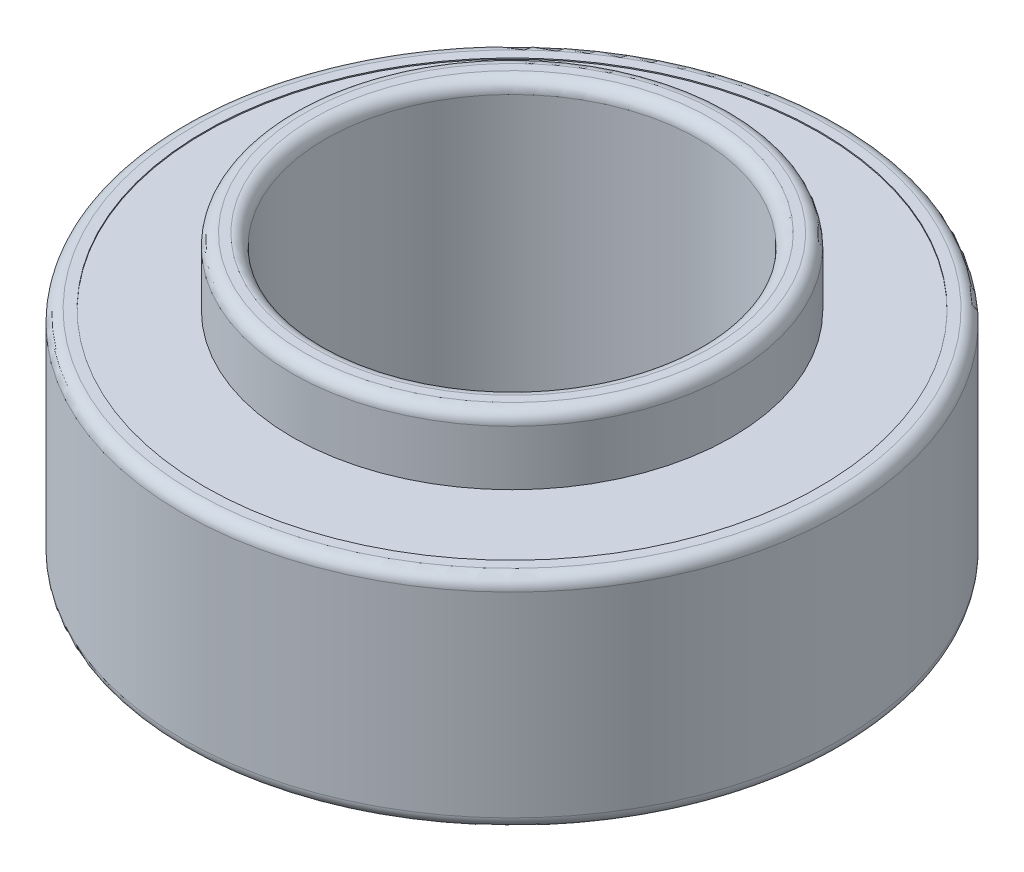
ISO-10303-21;
HEADER;
FILE_DESCRIPTION(('STEP AP214'),'2;1');
FILE_NAME('part.step','',(''),(''),'','','');
FILE_SCHEMA(('AUTOMOTIVE_DESIGN { 1 0 10303 214 1 1 1 1 }'));
ENDSEC;
DATA;
#1=APPLICATION_CONTEXT('core data for automotive mechanical design processes');
#2=APPLICATION_PROTOCOL_DEFINITION('international standard','automotive_design',2000,#1);
#3=PRODUCT_CONTEXT('',#1,'mechanical');
#4=PRODUCT('Part','Part','',(#3));
#5=PRODUCT_RELATED_PRODUCT_CATEGORY('part','',(#4));
#6=PRODUCT_DEFINITION_FORMATION('','',#4);
#7=PRODUCT_DEFINITION_CONTEXT('part definition',#1,'design');
#8=PRODUCT_DEFINITION('design','',#6,#7);
#9=PRODUCT_DEFINITION_SHAPE('','',#8);
#10=(LENGTH_UNIT() NAMED_UNIT(*) SI_UNIT(.MILLI.,.METRE.));
#11=(NAMED_UNIT(*) PLANE_ANGLE_UNIT() SI_UNIT($,.RADIAN.));
#12=(NAMED_UNIT(*) SI_UNIT($,.STERADIAN.) SOLID_ANGLE_UNIT());
#13=UNCERTAINTY_MEASURE_WITH_UNIT(LENGTH_MEASURE(1.E-05),#10,'distance_accuracy_value','');
#14=(GEOMETRIC_REPRESENTATION_CONTEXT(3) GLOBAL_UNCERTAINTY_ASSIGNED_CONTEXT((#13)) GLOBAL_UNIT_ASSIGNED_CONTEXT((#10,
#11,#12)) REPRESENTATION_CONTEXT('',''));
#15=CARTESIAN_POINT('',(0.,0.,0.));
#16=DIRECTION('',(0.,0.,1.));
#17=DIRECTION('',(1.,0.,0.));
#18=AXIS2_PLACEMENT_3D('',#15,#16,#17);
#19=CARTESIAN_POINT('',(0.,-5.,0.));
#20=DIRECTION('',(0.,1.,0.));
#21=DIRECTION('',(0.,0.,1.));
#22=AXIS2_PLACEMENT_3D('',#19,#20,#21);
#23=PLANE('',#22);
#24=CARTESIAN_POINT('',(0.,-5.,0.));
#25=DIRECTION('',(0.,1.,0.));
#26=DIRECTION('',(0.,0.,1.));
#27=AXIS2_PLACEMENT_3D('',#24,#25,#26);
#28=CIRCLE('',#27,9.05);
#29=CARTESIAN_POINT('',(0.,-5.,9.05));
#30=VERTEX_POINT('',#29);
#31=EDGE_CURVE('E77',#30,#30,#28,.T.);
#32=ORIENTED_EDGE('',*,*,#31,.T.);
#33=EDGE_LOOP('',(#32));
#34=FACE_BOUND('',#33,.T.);
#35=CARTESIAN_POINT('',(0.,-5.,0.));
#36=DIRECTION('',(0.,1.,0.));
#37=DIRECTION('',(0.,0.,1.));
#38=AXIS2_PLACEMENT_3D('',#35,#36,#37);
#39=CIRCLE('',#38,10.);
#40=CARTESIAN_POINT('',(0.,-5.,10.));
#41=VERTEX_POINT('',#40);
#42=EDGE_CURVE('E118',#41,#41,#39,.T.);
#43=ORIENTED_EDGE('',*,*,#42,.F.);
#44=EDGE_LOOP('',(#43));
#45=FACE_BOUND('',#44,.T.);
#46=ADVANCED_FACE('F49',(#34,#45),#23,.F.);
#47=CARTESIAN_POINT('',(0.,5.,0.));
#48=DIRECTION('',(0.,1.,0.));
#49=DIRECTION('',(0.,0.,1.));
#50=AXIS2_PLACEMENT_3D('',#47,#48,#49);
#51=PLANE('',#50);
#52=CARTESIAN_POINT('',(0.,5.,0.));
#53=DIRECTION('',(0.,1.,0.));
#54=DIRECTION('',(0.,0.,1.));
#55=AXIS2_PLACEMENT_3D('',#52,#53,#54);
#56=CIRCLE('',#55,14.45);
#57=CARTESIAN_POINT('',(0.,5.,14.45));
#58=VERTEX_POINT('',#57);
#59=EDGE_CURVE('E57',#58,#58,#56,.T.);
#60=ORIENTED_EDGE('',*,*,#59,.T.);
#61=EDGE_LOOP('',(#60));
#62=FACE_BOUND('',#61,.T.);
#63=CARTESIAN_POINT('',(0.,5.,0.));
#64=DIRECTION('',(0.,1.,0.));
#65=DIRECTION('',(0.,0.,1.));
#66=AXIS2_PLACEMENT_3D('',#63,#64,#65);
#67=CIRCLE('',#66,14.);
#68=CARTESIAN_POINT('',(0.,5.,14.));
#69=VERTEX_POINT('',#68);
#70=EDGE_CURVE('E98',#69,#69,#67,.T.);
#71=ORIENTED_EDGE('',*,*,#70,.F.);
#72=EDGE_LOOP('',(#71));
#73=FACE_BOUND('',#72,.T.);
#74=ADVANCED_FACE('F137',(#62,#73),#51,.T.);
#75=CARTESIAN_POINT('',(0.,-5.,0.));
#76=DIRECTION('',(0.,1.,0.));
#77=DIRECTION('',(0.,0.,1.));
#78=AXIS2_PLACEMENT_3D('',#75,#76,#77);
#79=CIRCLE('',#78,14.45);
#80=CARTESIAN_POINT('',(0.,-5.,14.45));
#81=VERTEX_POINT('',#80);
#82=EDGE_CURVE('E62',#81,#81,#79,.F.);
#83=ORIENTED_EDGE('',*,*,#82,.T.);
#84=EDGE_LOOP('',(#83));
#85=FACE_BOUND('',#84,.T.);
#86=CARTESIAN_POINT('',(0.,-5.,0.));
#87=DIRECTION('',(0.,1.,0.));
#88=DIRECTION('',(0.,0.,1.));
#89=AXIS2_PLACEMENT_3D('',#86,#87,#88);
#90=CIRCLE('',#89,14.);
#91=CARTESIAN_POINT('',(0.,-5.,14.));
#92=VERTEX_POINT('',#91);
#93=EDGE_CURVE('E110',#92,#92,#90,.T.);
#94=ORIENTED_EDGE('',*,*,#93,.T.);
#95=EDGE_LOOP('',(#94));
#96=FACE_BOUND('',#95,.T.);
#97=ADVANCED_FACE('F140',(#85,#96),#23,.F.);
#98=CARTESIAN_POINT('',(0.,5.,0.));
#99=DIRECTION('',(0.,-1.,0.));
#100=DIRECTION('',(0.,0.,-1.));
#101=AXIS2_PLACEMENT_3D('',#98,#99,#100);
#102=CYLINDRICAL_SURFACE('',#101,15.);
#103=CARTESIAN_POINT('',(0.,-4.45,0.));
#104=DIRECTION('',(0.,1.,0.));
#105=DIRECTION('',(0.,0.,1.));
#106=AXIS2_PLACEMENT_3D('',#103,#104,#105);
#107=CIRCLE('',#106,15.);
#108=CARTESIAN_POINT('',(0.,-4.45,15.));
#109=VERTEX_POINT('',#108);
#110=EDGE_CURVE('E67',#109,#109,#107,.T.);
#111=ORIENTED_EDGE('',*,*,#110,.T.);
#112=EDGE_LOOP('',(#111));
#113=FACE_BOUND('',#112,.T.);
#114=CARTESIAN_POINT('',(0.,4.45,0.));
#115=DIRECTION('',(0.,1.,0.));
#116=DIRECTION('',(0.,0.,1.));
#117=AXIS2_PLACEMENT_3D('',#114,#115,#116);
#118=CIRCLE('',#117,15.);
#119=CARTESIAN_POINT('',(0.,4.45,15.));
#120=VERTEX_POINT('',#119);
#121=EDGE_CURVE('E73',#120,#120,#118,.F.);
#122=ORIENTED_EDGE('',*,*,#121,.T.);
#123=EDGE_LOOP('',(#122));
#124=FACE_BOUND('',#123,.T.);
#125=ADVANCED_FACE('F147',(#113,#124),#102,.T.);
#126=CARTESIAN_POINT('',(0.,5.,0.));
#127=DIRECTION('',(0.,-1.,0.));
#128=DIRECTION('',(0.,0.,-1.));
#129=AXIS2_PLACEMENT_3D('',#126,#127,#128);
#130=CYLINDRICAL_SURFACE('',#129,8.5);
#131=CARTESIAN_POINT('',(0.,7.45,0.));
#132=DIRECTION('',(0.,1.,0.));
#133=DIRECTION('',(0.,0.,1.));
#134=AXIS2_PLACEMENT_3D('',#131,#132,#133);
#135=CIRCLE('',#134,8.5);
#136=CARTESIAN_POINT('',(0.,7.45,8.5));
#137=VERTEX_POINT('',#136);
#138=EDGE_CURVE('E89',#137,#137,#135,.T.);
#139=ORIENTED_EDGE('',*,*,#138,.T.);
#140=EDGE_LOOP('',(#139));
#141=FACE_BOUND('',#140,.T.);
#142=CARTESIAN_POINT('',(0.,-4.45,0.));
#143=DIRECTION('',(0.,1.,0.));
#144=DIRECTION('',(0.,0.,1.));
#145=AXIS2_PLACEMENT_3D('',#142,#143,#144);
#146=CIRCLE('',#145,8.5);
#147=CARTESIAN_POINT('',(0.,-4.45,8.5));
#148=VERTEX_POINT('',#147);
#149=EDGE_CURVE('E93',#148,#148,#146,.F.);
#150=ORIENTED_EDGE('',*,*,#149,.T.);
#151=EDGE_LOOP('',(#150));
#152=FACE_BOUND('',#151,.T.);
#153=ADVANCED_FACE('F152',(#141,#152),#130,.F.);
#154=CARTESIAN_POINT('',(0.,8.,0.));
#155=DIRECTION('',(0.,1.,0.));
#156=DIRECTION('',(0.,0.,1.));
#157=AXIS2_PLACEMENT_3D('',#154,#155,#156);
#158=PLANE('',#157);
#159=CARTESIAN_POINT('',(0.,8.,0.));
#160=DIRECTION('',(0.,1.,0.));
#161=DIRECTION('',(0.,0.,1.));
#162=AXIS2_PLACEMENT_3D('',#159,#160,#161);
#163=CIRCLE('',#162,9.05);
#164=CARTESIAN_POINT('',(0.,8.,9.05));
#165=VERTEX_POINT('',#164);
#166=EDGE_CURVE('E81',#165,#165,#163,.F.);
#167=ORIENTED_EDGE('',*,*,#166,.T.);
#168=EDGE_LOOP('',(#167));
#169=FACE_BOUND('',#168,.T.);
#170=CARTESIAN_POINT('',(0.,8.,0.));
#171=DIRECTION('',(0.,1.,0.));
#172=DIRECTION('',(0.,0.,1.));
#173=AXIS2_PLACEMENT_3D('',#170,#171,#172);
#174=CIRCLE('',#173,9.45);
#175=CARTESIAN_POINT('',(0.,8.,9.45));
#176=VERTEX_POINT('',#175);
#177=EDGE_CURVE('E85',#176,#176,#174,.T.);
#178=ORIENTED_EDGE('',*,*,#177,.T.);
#179=EDGE_LOOP('',(#178));
#180=FACE_BOUND('',#179,.T.);
#181=ADVANCED_FACE('F177',(#169,#180),#158,.T.);
#182=CARTESIAN_POINT('',(0.,8.,0.));
#183=DIRECTION('',(0.,-1.,0.));
#184=DIRECTION('',(0.,0.,-1.));
#185=AXIS2_PLACEMENT_3D('',#182,#183,#184);
#186=CYLINDRICAL_SURFACE('',#185,10.);
#187=CARTESIAN_POINT('',(0.,7.45,0.));
#188=DIRECTION('',(0.,1.,0.));
#189=DIRECTION('',(0.,0.,1.));
#190=AXIS2_PLACEMENT_3D('',#187,#188,#189);
#191=CIRCLE('',#190,10.);
#192=CARTESIAN_POINT('',(0.,7.45,10.));
#193=VERTEX_POINT('',#192);
#194=EDGE_CURVE('E10',#193,#193,#191,.F.);
#195=ORIENTED_EDGE('',*,*,#194,.T.);
#196=EDGE_LOOP('',(#195));
#197=FACE_BOUND('',#196,.T.);
#198=CARTESIAN_POINT('',(0.,4.95,0.));
#199=DIRECTION('',(0.,1.,0.));
#200=DIRECTION('',(0.,0.,1.));
#201=AXIS2_PLACEMENT_3D('',#198,#199,#200);
#202=CIRCLE('',#201,10.);
#203=CARTESIAN_POINT('',(0.,4.95,10.));
#204=VERTEX_POINT('',#203);
#205=EDGE_CURVE('E102',#204,#204,#202,.T.);
#206=ORIENTED_EDGE('',*,*,#205,.T.);
#207=EDGE_LOOP('',(#206));
#208=FACE_BOUND('',#207,.T.);
#209=ADVANCED_FACE('F175',(#197,#208),#186,.T.);
#210=CARTESIAN_POINT('',(0.,4.95,0.));
#211=DIRECTION('',(0.,1.,0.));
#212=DIRECTION('',(0.,0.,1.));
#213=AXIS2_PLACEMENT_3D('',#210,#211,#212);
#214=CYLINDRICAL_SURFACE('',#213,14.);
#215=CARTESIAN_POINT('',(0.,4.95,0.));
#216=DIRECTION('',(0.,1.,0.));
#217=DIRECTION('',(0.,0.,1.));
#218=AXIS2_PLACEMENT_3D('',#215,#216,#217);
#219=CIRCLE('',#218,14.);
#220=CARTESIAN_POINT('',(0.,4.95,14.));
#221=VERTEX_POINT('',#220);
#222=EDGE_CURVE('E97',#221,#221,#219,.T.);
#223=ORIENTED_EDGE('',*,*,#222,.F.);
#224=EDGE_LOOP('',(#223));
#225=FACE_BOUND('',#224,.T.);
#226=ORIENTED_EDGE('',*,*,#70,.T.);
#227=EDGE_LOOP('',(#226));
#228=FACE_BOUND('',#227,.T.);
#229=ADVANCED_FACE('F171',(#225,#228),#214,.F.);
#230=CARTESIAN_POINT('',(0.,4.95,0.));
#231=DIRECTION('',(0.,1.,0.));
#232=DIRECTION('',(0.,0.,1.));
#233=AXIS2_PLACEMENT_3D('',#230,#231,#232);
#234=PLANE('',#233);
#235=ORIENTED_EDGE('',*,*,#205,.F.);
#236=EDGE_LOOP('',(#235));
#237=FACE_BOUND('',#236,.T.);
#238=ORIENTED_EDGE('',*,*,#222,.T.);
#239=EDGE_LOOP('',(#238));
#240=FACE_BOUND('',#239,.T.);
#241=ADVANCED_FACE('F165',(#237,#240),#234,.T.);
#242=CARTESIAN_POINT('',(0.,-4.95,0.));
#243=DIRECTION('',(0.,-1.,0.));
#244=DIRECTION('',(0.,0.,1.));
#245=AXIS2_PLACEMENT_3D('',#242,#243,#244);
#246=PLANE('',#245);
#247=CARTESIAN_POINT('',(0.,-4.95,0.));
#248=DIRECTION('',(0.,1.,0.));
#249=DIRECTION('',(0.,0.,1.));
#250=AXIS2_PLACEMENT_3D('',#247,#248,#249);
#251=CIRCLE('',#250,14.);
#252=CARTESIAN_POINT('',(0.,-4.95,14.));
#253=VERTEX_POINT('',#252);
#254=EDGE_CURVE('E109',#253,#253,#251,.T.);
#255=ORIENTED_EDGE('',*,*,#254,.F.);
#256=EDGE_LOOP('',(#255));
#257=FACE_BOUND('',#256,.T.);
#258=CARTESIAN_POINT('',(0.,-4.95,0.));
#259=DIRECTION('',(0.,1.,0.));
#260=DIRECTION('',(0.,0.,1.));
#261=AXIS2_PLACEMENT_3D('',#258,#259,#260);
#262=CIRCLE('',#261,10.);
#263=CARTESIAN_POINT('',(0.,-4.95,10.));
#264=VERTEX_POINT('',#263);
#265=EDGE_CURVE('E114',#264,#264,#262,.T.);
#266=ORIENTED_EDGE('',*,*,#265,.T.);
#267=EDGE_LOOP('',(#266));
#268=FACE_BOUND('',#267,.T.);
#269=ADVANCED_FACE('F126',(#257,#268),#246,.T.);
#270=CARTESIAN_POINT('',(0.,-4.95,0.));
#271=DIRECTION('',(0.,-1.,0.));
#272=DIRECTION('',(0.,0.,-1.));
#273=AXIS2_PLACEMENT_3D('',#270,#271,#272);
#274=CYLINDRICAL_SURFACE('',#273,14.);
#275=ORIENTED_EDGE('',*,*,#254,.T.);
#276=EDGE_LOOP('',(#275));
#277=FACE_BOUND('',#276,.T.);
#278=ORIENTED_EDGE('',*,*,#93,.F.);
#279=EDGE_LOOP('',(#278));
#280=FACE_BOUND('',#279,.T.);
#281=ADVANCED_FACE('F132',(#277,#280),#274,.F.);
#282=CARTESIAN_POINT('',(0.,-4.95,0.));
#283=DIRECTION('',(0.,-1.,0.));
#284=DIRECTION('',(0.,0.,-1.));
#285=AXIS2_PLACEMENT_3D('',#282,#283,#284);
#286=CYLINDRICAL_SURFACE('',#285,10.);
#287=ORIENTED_EDGE('',*,*,#265,.F.);
#288=EDGE_LOOP('',(#287));
#289=FACE_BOUND('',#288,.T.);
#290=ORIENTED_EDGE('',*,*,#42,.T.);
#291=EDGE_LOOP('',(#290));
#292=FACE_BOUND('',#291,.T.);
#293=ADVANCED_FACE('F128',(#289,#292),#286,.T.);
#294=CARTESIAN_POINT('',(0.,7.45,0.));
#295=DIRECTION('',(0.,1.,0.));
#296=DIRECTION('',(0.,0.,1.));
#297=AXIS2_PLACEMENT_3D('',#294,#295,#296);
#298=TOROIDAL_SURFACE('',#297,9.05,0.55);
#299=ORIENTED_EDGE('',*,*,#166,.F.);
#300=EDGE_LOOP('',(#299));
#301=FACE_BOUND('',#300,.T.);
#302=ORIENTED_EDGE('',*,*,#138,.F.);
#303=EDGE_LOOP('',(#302));
#304=FACE_BOUND('',#303,.T.);
#305=ADVANCED_FACE('F131',(#301,#304),#298,.T.);
#306=CARTESIAN_POINT('',(0.,-4.45,0.));
#307=DIRECTION('',(0.,1.,0.));
#308=DIRECTION('',(0.,0.,1.));
#309=AXIS2_PLACEMENT_3D('',#306,#307,#308);
#310=TOROIDAL_SURFACE('',#309,9.05,0.55);
#311=ORIENTED_EDGE('',*,*,#149,.F.);
#312=EDGE_LOOP('',(#311));
#313=FACE_BOUND('',#312,.T.);
#314=ORIENTED_EDGE('',*,*,#31,.F.);
#315=EDGE_LOOP('',(#314));
#316=FACE_BOUND('',#315,.T.);
#317=ADVANCED_FACE('F191',(#313,#316),#310,.T.);
#318=CARTESIAN_POINT('',(0.,-4.45,0.));
#319=DIRECTION('',(0.,1.,0.));
#320=DIRECTION('',(0.,0.,1.));
#321=AXIS2_PLACEMENT_3D('',#318,#319,#320);
#322=TOROIDAL_SURFACE('',#321,14.45,0.55);
#323=ORIENTED_EDGE('',*,*,#82,.F.);
#324=EDGE_LOOP('',(#323));
#325=FACE_BOUND('',#324,.T.);
#326=ORIENTED_EDGE('',*,*,#110,.F.);
#327=EDGE_LOOP('',(#326));
#328=FACE_BOUND('',#327,.T.);
#329=ADVANCED_FACE('F194',(#325,#328),#322,.T.);
#330=CARTESIAN_POINT('',(0.,4.45,0.));
#331=DIRECTION('',(0.,1.,0.));
#332=DIRECTION('',(0.,0.,1.));
#333=AXIS2_PLACEMENT_3D('',#330,#331,#332);
#334=TOROIDAL_SURFACE('',#333,14.45,0.55);
#335=ORIENTED_EDGE('',*,*,#121,.F.);
#336=EDGE_LOOP('',(#335));
#337=FACE_BOUND('',#336,.T.);
#338=ORIENTED_EDGE('',*,*,#59,.F.);
#339=EDGE_LOOP('',(#338));
#340=FACE_BOUND('',#339,.T.);
#341=ADVANCED_FACE('F201',(#337,#340),#334,.T.);
#342=CARTESIAN_POINT('',(0.,7.45,0.));
#343=DIRECTION('',(0.,1.,0.));
#344=DIRECTION('',(0.,0.,1.));
#345=AXIS2_PLACEMENT_3D('',#342,#343,#344);
#346=TOROIDAL_SURFACE('',#345,9.45,0.55);
#347=ORIENTED_EDGE('',*,*,#194,.F.);
#348=EDGE_LOOP('',(#347));
#349=FACE_BOUND('',#348,.T.);
#350=ORIENTED_EDGE('',*,*,#177,.F.);
#351=EDGE_LOOP('',(#350));
#352=FACE_BOUND('',#351,.T.);
#353=ADVANCED_FACE('F51',(#349,#352),#346,.T.);
#354=CLOSED_SHELL('',(#46,#74,#97,#125,#153,#181,#209,#229,#241,#269,#281,#293,#305,#317,#329,
#341,#353));
#355=MANIFOLD_SOLID_BREP('B2',#354);
#356=ADVANCED_BREP_SHAPE_REPRESENTATION('',(#18,#355),#14);
#357=SHAPE_DEFINITION_REPRESENTATION(#9,#356);
ENDSEC;
END-ISO-10303-21;
